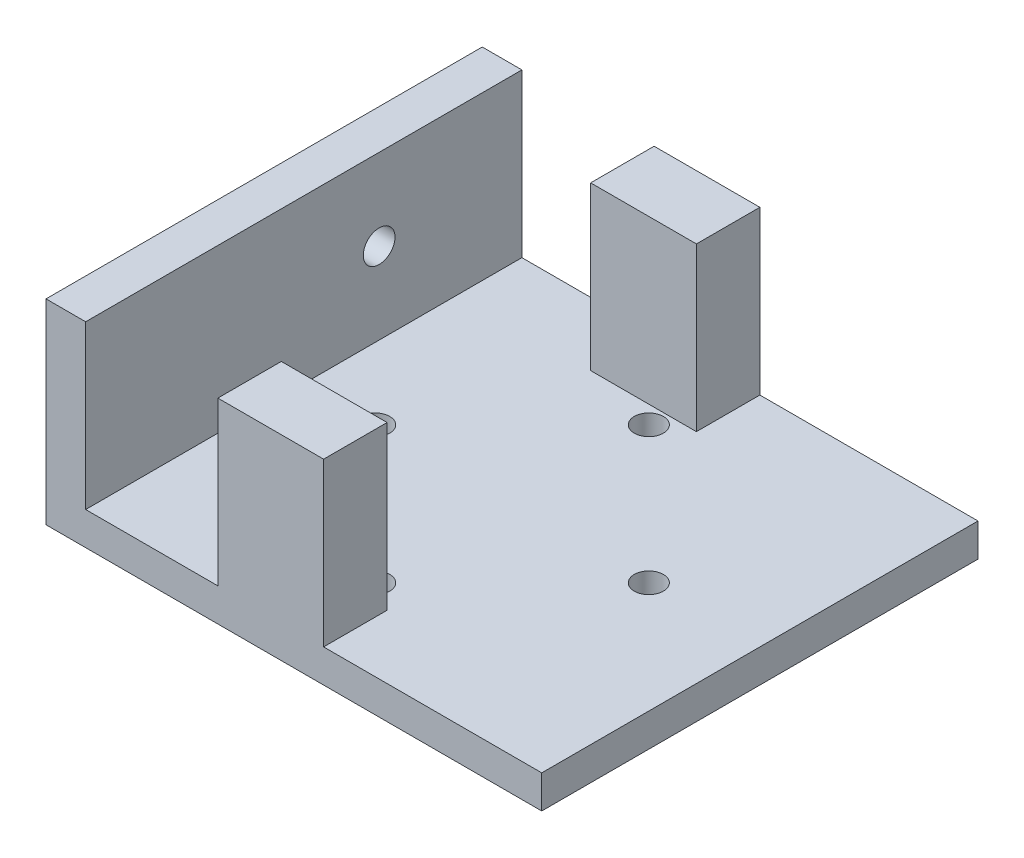
ISO-10303-21;
HEADER;
FILE_DESCRIPTION(('STEP AP214'),'2;1');
FILE_NAME('part.step','',(''),(''),'','','');
FILE_SCHEMA(('AUTOMOTIVE_DESIGN { 1 0 10303 214 1 1 1 1 }'));
ENDSEC;
DATA;
#1=APPLICATION_CONTEXT('core data for automotive mechanical design processes');
#2=APPLICATION_PROTOCOL_DEFINITION('international standard','automotive_design',2000,#1);
#3=PRODUCT_CONTEXT('',#1,'mechanical');
#4=PRODUCT('Part','Part','',(#3));
#5=PRODUCT_RELATED_PRODUCT_CATEGORY('part','',(#4));
#6=PRODUCT_DEFINITION_FORMATION('','',#4);
#7=PRODUCT_DEFINITION_CONTEXT('part definition',#1,'design');
#8=PRODUCT_DEFINITION('design','',#6,#7);
#9=PRODUCT_DEFINITION_SHAPE('','',#8);
#10=(LENGTH_UNIT() NAMED_UNIT(*) SI_UNIT(.MILLI.,.METRE.));
#11=(NAMED_UNIT(*) PLANE_ANGLE_UNIT() SI_UNIT($,.RADIAN.));
#12=(NAMED_UNIT(*) SI_UNIT($,.STERADIAN.) SOLID_ANGLE_UNIT());
#13=UNCERTAINTY_MEASURE_WITH_UNIT(LENGTH_MEASURE(1.E-05),#10,'distance_accuracy_value','');
#14=(GEOMETRIC_REPRESENTATION_CONTEXT(3) GLOBAL_UNCERTAINTY_ASSIGNED_CONTEXT((#13)) GLOBAL_UNIT_ASSIGNED_CONTEXT((#10,
#11,#12)) REPRESENTATION_CONTEXT('',''));
#15=CARTESIAN_POINT('',(0.,0.,0.));
#16=DIRECTION('',(0.,0.,1.));
#17=DIRECTION('',(1.,0.,0.));
#18=AXIS2_PLACEMENT_3D('',#15,#16,#17);
#19=CARTESIAN_POINT('',(0.,2.5,0.));
#20=DIRECTION('',(0.,-1.,0.));
#21=DIRECTION('',(0.,0.,-1.));
#22=AXIS2_PLACEMENT_3D('',#19,#20,#21);
#23=PLANE('',#22);
#24=CARTESIAN_POINT('',(-10.35,2.5,0.));
#25=DIRECTION('',(0.,-1.,0.));
#26=DIRECTION('',(0.,0.,-1.));
#27=AXIS2_PLACEMENT_3D('',#24,#25,#26);
#28=CIRCLE('',#27,1.1);
#29=CARTESIAN_POINT('',(-10.35,2.5,-1.1));
#30=VERTEX_POINT('',#29);
#31=EDGE_CURVE('E170',#30,#30,#28,.T.);
#32=ORIENTED_EDGE('',*,*,#31,.T.);
#33=EDGE_LOOP('',(#32));
#34=FACE_BOUND('',#33,.T.);
#35=CARTESIAN_POINT('',(0.,2.5,10.35));
#36=DIRECTION('',(0.,-1.,0.));
#37=DIRECTION('',(0.,0.,-1.));
#38=AXIS2_PLACEMENT_3D('',#35,#36,#37);
#39=CIRCLE('',#38,1.1);
#40=CARTESIAN_POINT('',(0.,2.5,9.25));
#41=VERTEX_POINT('',#40);
#42=EDGE_CURVE('E488',#41,#41,#39,.T.);
#43=ORIENTED_EDGE('',*,*,#42,.T.);
#44=EDGE_LOOP('',(#43));
#45=FACE_BOUND('',#44,.T.);
#46=CARTESIAN_POINT('',(10.35,2.5,0.));
#47=DIRECTION('',(0.,-1.,0.));
#48=DIRECTION('',(0.,0.,-1.));
#49=AXIS2_PLACEMENT_3D('',#46,#47,#48);
#50=CIRCLE('',#49,1.1);
#51=CARTESIAN_POINT('',(10.35,2.5,-1.1));
#52=VERTEX_POINT('',#51);
#53=EDGE_CURVE('E485',#52,#52,#50,.T.);
#54=ORIENTED_EDGE('',*,*,#53,.T.);
#55=EDGE_LOOP('',(#54));
#56=FACE_BOUND('',#55,.T.);
#57=CARTESIAN_POINT('',(0.,2.5,-10.35));
#58=DIRECTION('',(0.,-1.,0.));
#59=DIRECTION('',(0.,0.,-1.));
#60=AXIS2_PLACEMENT_3D('',#57,#58,#59);
#61=CIRCLE('',#60,1.1);
#62=CARTESIAN_POINT('',(0.,2.5,-11.45));
#63=VERTEX_POINT('',#62);
#64=EDGE_CURVE('E474',#63,#63,#61,.T.);
#65=ORIENTED_EDGE('',*,*,#64,.T.);
#66=EDGE_LOOP('',(#65));
#67=FACE_BOUND('',#66,.T.);
#68=DIRECTION('',(0.,0.,-1.));
#69=VECTOR('',#68,1.);
#70=CARTESIAN_POINT('',(2.25,2.5,-16.5));
#71=LINE('',#70,#69);
#72=CARTESIAN_POINT('',(2.25,2.5,-11.7));
#73=VERTEX_POINT('',#72);
#74=CARTESIAN_POINT('',(2.25,2.5,-16.5));
#75=VERTEX_POINT('',#74);
#76=EDGE_CURVE('E60',#73,#75,#71,.T.);
#77=ORIENTED_EDGE('',*,*,#76,.F.);
#78=DIRECTION('',(1.,0.,0.));
#79=VECTOR('',#78,1.);
#80=CARTESIAN_POINT('',(2.25,2.5,-11.7));
#81=LINE('',#80,#79);
#82=CARTESIAN_POINT('',(-5.75,2.5,-11.7));
#83=VERTEX_POINT('',#82);
#84=EDGE_CURVE('E64',#83,#73,#81,.T.);
#85=ORIENTED_EDGE('',*,*,#84,.F.);
#86=DIRECTION('',(0.,0.,1.));
#87=VECTOR('',#86,1.);
#88=CARTESIAN_POINT('',(-5.75,2.5,-16.5));
#89=LINE('',#88,#87);
#90=CARTESIAN_POINT('',(-5.75,2.5,-16.5));
#91=VERTEX_POINT('',#90);
#92=EDGE_CURVE('E157',#91,#83,#89,.T.);
#93=ORIENTED_EDGE('',*,*,#92,.F.);
#94=DIRECTION('',(-1.,0.,0.));
#95=VECTOR('',#94,1.);
#96=CARTESIAN_POINT('',(-18.75,2.5,-16.5));
#97=LINE('',#96,#95);
#98=CARTESIAN_POINT('',(-15.75,2.5,-16.5));
#99=VERTEX_POINT('',#98);
#100=EDGE_CURVE('E145',#91,#99,#97,.T.);
#101=ORIENTED_EDGE('',*,*,#100,.T.);
#102=DIRECTION('',(0.,0.,-1.));
#103=VECTOR('',#102,1.);
#104=CARTESIAN_POINT('',(-15.75,2.5,-16.5));
#105=LINE('',#104,#103);
#106=CARTESIAN_POINT('',(-15.75,2.5,16.5));
#107=VERTEX_POINT('',#106);
#108=EDGE_CURVE('E209',#107,#99,#105,.T.);
#109=ORIENTED_EDGE('',*,*,#108,.F.);
#110=DIRECTION('',(1.,0.,0.));
#111=VECTOR('',#110,1.);
#112=CARTESIAN_POINT('',(-18.75,2.5,16.5));
#113=LINE('',#112,#111);
#114=CARTESIAN_POINT('',(-5.74999999999999,2.5,16.5));
#115=VERTEX_POINT('',#114);
#116=EDGE_CURVE('E237',#107,#115,#113,.T.);
#117=ORIENTED_EDGE('',*,*,#116,.T.);
#118=DIRECTION('',(0.,0.,1.));
#119=VECTOR('',#118,1.);
#120=CARTESIAN_POINT('',(-5.74999999999999,2.5,16.5));
#121=LINE('',#120,#119);
#122=CARTESIAN_POINT('',(-5.74999999999999,2.5,11.7));
#123=VERTEX_POINT('',#122);
#124=EDGE_CURVE('E199',#123,#115,#121,.T.);
#125=ORIENTED_EDGE('',*,*,#124,.F.);
#126=DIRECTION('',(-1.,0.,0.));
#127=VECTOR('',#126,1.);
#128=CARTESIAN_POINT('',(2.25000000000001,2.5,11.7));
#129=LINE('',#128,#127);
#130=CARTESIAN_POINT('',(2.25000000000001,2.5,11.7));
#131=VERTEX_POINT('',#130);
#132=EDGE_CURVE('E202',#131,#123,#129,.T.);
#133=ORIENTED_EDGE('',*,*,#132,.F.);
#134=DIRECTION('',(0.,0.,-1.));
#135=VECTOR('',#134,1.);
#136=CARTESIAN_POINT('',(2.25000000000001,2.5,16.5));
#137=LINE('',#136,#135);
#138=CARTESIAN_POINT('',(2.25000000000001,2.5,16.5));
#139=VERTEX_POINT('',#138);
#140=EDGE_CURVE('E206',#139,#131,#137,.T.);
#141=ORIENTED_EDGE('',*,*,#140,.F.);
#142=CARTESIAN_POINT('',(18.75,2.5,16.5));
#143=VERTEX_POINT('',#142);
#144=EDGE_CURVE('E236',#139,#143,#113,.T.);
#145=ORIENTED_EDGE('',*,*,#144,.T.);
#146=DIRECTION('',(0.,0.,-1.));
#147=VECTOR('',#146,1.);
#148=CARTESIAN_POINT('',(18.75,2.5,16.5));
#149=LINE('',#148,#147);
#150=CARTESIAN_POINT('',(18.75,2.5,-16.5));
#151=VERTEX_POINT('',#150);
#152=EDGE_CURVE('E155',#143,#151,#149,.T.);
#153=ORIENTED_EDGE('',*,*,#152,.T.);
#154=EDGE_CURVE('E154',#151,#75,#97,.T.);
#155=ORIENTED_EDGE('',*,*,#154,.T.);
#156=EDGE_LOOP('',(#77,#85,#93,#101,#109,#117,#125,#133,#141,#145,#153,#155));
#157=FACE_BOUND('',#156,.T.);
#158=ADVANCED_FACE('F45',(#34,#45,#56,#67,#157),#23,.F.);
#159=CARTESIAN_POINT('',(18.75,2.5,16.5));
#160=DIRECTION('',(-1.,0.,0.));
#161=DIRECTION('',(0.,0.,1.));
#162=AXIS2_PLACEMENT_3D('',#159,#160,#161);
#163=PLANE('',#162);
#164=DIRECTION('',(0.,0.,-1.));
#165=VECTOR('',#164,1.);
#166=CARTESIAN_POINT('',(18.75,0.,16.5));
#167=LINE('',#166,#165);
#168=CARTESIAN_POINT('',(18.75,0.,16.5));
#169=VERTEX_POINT('',#168);
#170=CARTESIAN_POINT('',(18.75,0.,-16.5));
#171=VERTEX_POINT('',#170);
#172=EDGE_CURVE('E232',#169,#171,#167,.T.);
#173=ORIENTED_EDGE('',*,*,#172,.T.);
#174=DIRECTION('',(0.,-1.,0.));
#175=VECTOR('',#174,1.);
#176=CARTESIAN_POINT('',(18.75,2.5,-16.5));
#177=LINE('',#176,#175);
#178=EDGE_CURVE('E11',#151,#171,#177,.T.);
#179=ORIENTED_EDGE('',*,*,#178,.F.);
#180=ORIENTED_EDGE('',*,*,#152,.F.);
#181=DIRECTION('',(0.,-1.,0.));
#182=VECTOR('',#181,1.);
#183=CARTESIAN_POINT('',(18.75,2.5,16.5));
#184=LINE('',#183,#182);
#185=EDGE_CURVE('E239',#143,#169,#184,.T.);
#186=ORIENTED_EDGE('',*,*,#185,.T.);
#187=EDGE_LOOP('',(#173,#179,#180,#186));
#188=FACE_BOUND('',#187,.T.);
#189=ADVANCED_FACE('F47',(#188),#163,.F.);
#190=CARTESIAN_POINT('',(-18.75,2.5,-16.5));
#191=DIRECTION('',(0.,0.,1.));
#192=DIRECTION('',(1.,0.,0.));
#193=AXIS2_PLACEMENT_3D('',#190,#191,#192);
#194=PLANE('',#193);
#195=DIRECTION('',(-1.,0.,0.));
#196=VECTOR('',#195,1.);
#197=CARTESIAN_POINT('',(-18.75,0.,-16.5));
#198=LINE('',#197,#196);
#199=CARTESIAN_POINT('',(-18.75,0.,-16.5));
#200=VERTEX_POINT('',#199);
#201=EDGE_CURVE('E242',#171,#200,#198,.T.);
#202=ORIENTED_EDGE('',*,*,#201,.T.);
#203=DIRECTION('',(0.,-1.,0.));
#204=VECTOR('',#203,1.);
#205=CARTESIAN_POINT('',(-18.75,2.5,-16.5));
#206=LINE('',#205,#204);
#207=CARTESIAN_POINT('',(-18.75,14.8,-16.5));
#208=VERTEX_POINT('',#207);
#209=EDGE_CURVE('E53',#208,#200,#206,.T.);
#210=ORIENTED_EDGE('',*,*,#209,.F.);
#211=DIRECTION('',(-1.,0.,0.));
#212=VECTOR('',#211,1.);
#213=CARTESIAN_POINT('',(-18.75,14.8,-16.5));
#214=LINE('',#213,#212);
#215=CARTESIAN_POINT('',(-15.75,14.8,-16.5));
#216=VERTEX_POINT('',#215);
#217=EDGE_CURVE('E224',#216,#208,#214,.T.);
#218=ORIENTED_EDGE('',*,*,#217,.F.);
#219=DIRECTION('',(0.,-1.,0.));
#220=VECTOR('',#219,1.);
#221=CARTESIAN_POINT('',(-15.75,14.8,-16.5));
#222=LINE('',#221,#220);
#223=EDGE_CURVE('E152',#216,#99,#222,.T.);
#224=ORIENTED_EDGE('',*,*,#223,.T.);
#225=ORIENTED_EDGE('',*,*,#100,.F.);
#226=DIRECTION('',(0.,-1.,0.));
#227=VECTOR('',#226,1.);
#228=CARTESIAN_POINT('',(-5.75,14.8,-16.5));
#229=LINE('',#228,#227);
#230=CARTESIAN_POINT('',(-5.75,14.8,-16.5));
#231=VERTEX_POINT('',#230);
#232=EDGE_CURVE('E148',#231,#91,#229,.T.);
#233=ORIENTED_EDGE('',*,*,#232,.F.);
#234=DIRECTION('',(-1.,0.,0.));
#235=VECTOR('',#234,1.);
#236=CARTESIAN_POINT('',(2.25,14.8,-16.5));
#237=LINE('',#236,#235);
#238=CARTESIAN_POINT('',(2.25,14.8,-16.5));
#239=VERTEX_POINT('',#238);
#240=EDGE_CURVE('E183',#239,#231,#237,.T.);
#241=ORIENTED_EDGE('',*,*,#240,.F.);
#242=DIRECTION('',(0.,-1.,0.));
#243=VECTOR('',#242,1.);
#244=CARTESIAN_POINT('',(2.25,14.8,-16.5));
#245=LINE('',#244,#243);
#246=EDGE_CURVE('E165',#239,#75,#245,.T.);
#247=ORIENTED_EDGE('',*,*,#246,.T.);
#248=ORIENTED_EDGE('',*,*,#154,.F.);
#249=ORIENTED_EDGE('',*,*,#178,.T.);
#250=EDGE_LOOP('',(#202,#210,#218,#224,#225,#233,#241,#247,#248,#249));
#251=FACE_BOUND('',#250,.T.);
#252=ADVANCED_FACE('F146',(#251),#194,.F.);
#253=CARTESIAN_POINT('',(-18.75,2.5,16.5));
#254=DIRECTION('',(1.,0.,0.));
#255=DIRECTION('',(0.,0.,-1.));
#256=AXIS2_PLACEMENT_3D('',#253,#254,#255);
#257=PLANE('',#256);
#258=CARTESIAN_POINT('',(-18.75,8.65,-5.7));
#259=DIRECTION('',(1.,0.,0.));
#260=DIRECTION('',(0.,0.,-1.));
#261=AXIS2_PLACEMENT_3D('',#258,#259,#260);
#262=CIRCLE('',#261,1.2);
#263=CARTESIAN_POINT('',(-18.75,8.65,-6.9));
#264=VERTEX_POINT('',#263);
#265=EDGE_CURVE('E463',#264,#264,#262,.T.);
#266=ORIENTED_EDGE('',*,*,#265,.T.);
#267=EDGE_LOOP('',(#266));
#268=FACE_BOUND('',#267,.T.);
#269=DIRECTION('',(0.,0.,1.));
#270=VECTOR('',#269,1.);
#271=CARTESIAN_POINT('',(-18.75,0.,16.5));
#272=LINE('',#271,#270);
#273=CARTESIAN_POINT('',(-18.75,0.,16.5));
#274=VERTEX_POINT('',#273);
#275=EDGE_CURVE('E244',#200,#274,#272,.T.);
#276=ORIENTED_EDGE('',*,*,#275,.T.);
#277=DIRECTION('',(0.,-1.,0.));
#278=VECTOR('',#277,1.);
#279=CARTESIAN_POINT('',(-18.75,2.5,16.5));
#280=LINE('',#279,#278);
#281=CARTESIAN_POINT('',(-18.75,14.8,16.5));
#282=VERTEX_POINT('',#281);
#283=EDGE_CURVE('E249',#282,#274,#280,.T.);
#284=ORIENTED_EDGE('',*,*,#283,.F.);
#285=DIRECTION('',(0.,0.,1.));
#286=VECTOR('',#285,1.);
#287=CARTESIAN_POINT('',(-18.75,14.8,-16.5));
#288=LINE('',#287,#286);
#289=EDGE_CURVE('E217',#208,#282,#288,.T.);
#290=ORIENTED_EDGE('',*,*,#289,.F.);
#291=ORIENTED_EDGE('',*,*,#209,.T.);
#292=EDGE_LOOP('',(#276,#284,#290,#291));
#293=FACE_BOUND('',#292,.T.);
#294=ADVANCED_FACE('F255',(#268,#293),#257,.F.);
#295=CARTESIAN_POINT('',(-18.75,2.5,16.5));
#296=DIRECTION('',(0.,0.,-1.));
#297=DIRECTION('',(-1.,0.,0.));
#298=AXIS2_PLACEMENT_3D('',#295,#296,#297);
#299=PLANE('',#298);
#300=DIRECTION('',(1.,0.,0.));
#301=VECTOR('',#300,1.);
#302=CARTESIAN_POINT('',(-18.75,0.,16.5));
#303=LINE('',#302,#301);
#304=EDGE_CURVE('E234',#274,#169,#303,.T.);
#305=ORIENTED_EDGE('',*,*,#304,.T.);
#306=ORIENTED_EDGE('',*,*,#185,.F.);
#307=ORIENTED_EDGE('',*,*,#144,.F.);
#308=DIRECTION('',(0.,-1.,0.));
#309=VECTOR('',#308,1.);
#310=CARTESIAN_POINT('',(2.25000000000001,14.8,16.5));
#311=LINE('',#310,#309);
#312=CARTESIAN_POINT('',(2.25000000000001,14.8,16.5));
#313=VERTEX_POINT('',#312);
#314=EDGE_CURVE('E195',#313,#139,#311,.T.);
#315=ORIENTED_EDGE('',*,*,#314,.F.);
#316=DIRECTION('',(1.,0.,0.));
#317=VECTOR('',#316,1.);
#318=CARTESIAN_POINT('',(2.25000000000001,14.8,16.5));
#319=LINE('',#318,#317);
#320=CARTESIAN_POINT('',(-5.74999999999999,14.8,16.5));
#321=VERTEX_POINT('',#320);
#322=EDGE_CURVE('E198',#321,#313,#319,.T.);
#323=ORIENTED_EDGE('',*,*,#322,.F.);
#324=DIRECTION('',(0.,-1.,0.));
#325=VECTOR('',#324,1.);
#326=CARTESIAN_POINT('',(-5.74999999999999,14.8,16.5));
#327=LINE('',#326,#325);
#328=EDGE_CURVE('E192',#321,#115,#327,.T.);
#329=ORIENTED_EDGE('',*,*,#328,.T.);
#330=ORIENTED_EDGE('',*,*,#116,.F.);
#331=DIRECTION('',(0.,-1.,0.));
#332=VECTOR('',#331,1.);
#333=CARTESIAN_POINT('',(-15.75,14.8,16.5));
#334=LINE('',#333,#332);
#335=CARTESIAN_POINT('',(-15.75,14.8,16.5));
#336=VERTEX_POINT('',#335);
#337=EDGE_CURVE('E229',#336,#107,#334,.T.);
#338=ORIENTED_EDGE('',*,*,#337,.F.);
#339=DIRECTION('',(1.,0.,0.));
#340=VECTOR('',#339,1.);
#341=CARTESIAN_POINT('',(-18.75,14.8,16.5));
#342=LINE('',#341,#340);
#343=EDGE_CURVE('E220',#282,#336,#342,.T.);
#344=ORIENTED_EDGE('',*,*,#343,.F.);
#345=ORIENTED_EDGE('',*,*,#283,.T.);
#346=EDGE_LOOP('',(#305,#306,#307,#315,#323,#329,#330,#338,#344,#345));
#347=FACE_BOUND('',#346,.T.);
#348=ADVANCED_FACE('F262',(#347),#299,.F.);
#349=CARTESIAN_POINT('',(0.,0.,0.));
#350=DIRECTION('',(0.,-1.,0.));
#351=DIRECTION('',(0.,0.,-1.));
#352=AXIS2_PLACEMENT_3D('',#349,#350,#351);
#353=PLANE('',#352);
#354=CARTESIAN_POINT('',(-10.35,0.,0.));
#355=DIRECTION('',(0.,-1.,0.));
#356=DIRECTION('',(0.,0.,-1.));
#357=AXIS2_PLACEMENT_3D('',#354,#355,#356);
#358=CIRCLE('',#357,1.1);
#359=CARTESIAN_POINT('',(-10.35,0.,-1.1));
#360=VERTEX_POINT('',#359);
#361=EDGE_CURVE('E471',#360,#360,#358,.T.);
#362=ORIENTED_EDGE('',*,*,#361,.F.);
#363=EDGE_LOOP('',(#362));
#364=FACE_BOUND('',#363,.T.);
#365=CARTESIAN_POINT('',(0.,0.,10.35));
#366=DIRECTION('',(0.,-1.,0.));
#367=DIRECTION('',(0.,0.,-1.));
#368=AXIS2_PLACEMENT_3D('',#365,#366,#367);
#369=CIRCLE('',#368,1.1);
#370=CARTESIAN_POINT('',(0.,0.,9.25));
#371=VERTEX_POINT('',#370);
#372=EDGE_CURVE('E475',#371,#371,#369,.T.);
#373=ORIENTED_EDGE('',*,*,#372,.F.);
#374=EDGE_LOOP('',(#373));
#375=FACE_BOUND('',#374,.T.);
#376=CARTESIAN_POINT('',(10.35,0.,0.));
#377=DIRECTION('',(0.,-1.,0.));
#378=DIRECTION('',(0.,0.,-1.));
#379=AXIS2_PLACEMENT_3D('',#376,#377,#378);
#380=CIRCLE('',#379,1.1);
#381=CARTESIAN_POINT('',(10.35,0.,-1.1));
#382=VERTEX_POINT('',#381);
#383=EDGE_CURVE('E478',#382,#382,#380,.T.);
#384=ORIENTED_EDGE('',*,*,#383,.F.);
#385=EDGE_LOOP('',(#384));
#386=FACE_BOUND('',#385,.T.);
#387=CARTESIAN_POINT('',(0.,0.,-10.35));
#388=DIRECTION('',(0.,-1.,0.));
#389=DIRECTION('',(0.,0.,-1.));
#390=AXIS2_PLACEMENT_3D('',#387,#388,#389);
#391=CIRCLE('',#390,1.1);
#392=CARTESIAN_POINT('',(0.,0.,-11.45));
#393=VERTEX_POINT('',#392);
#394=EDGE_CURVE('E468',#393,#393,#391,.T.);
#395=ORIENTED_EDGE('',*,*,#394,.F.);
#396=EDGE_LOOP('',(#395));
#397=FACE_BOUND('',#396,.T.);
#398=ORIENTED_EDGE('',*,*,#172,.F.);
#399=ORIENTED_EDGE('',*,*,#304,.F.);
#400=ORIENTED_EDGE('',*,*,#275,.F.);
#401=ORIENTED_EDGE('',*,*,#201,.F.);
#402=EDGE_LOOP('',(#398,#399,#400,#401));
#403=FACE_BOUND('',#402,.T.);
#404=ADVANCED_FACE('F259',(#364,#375,#386,#397,#403),#353,.T.);
#405=CARTESIAN_POINT('',(-15.75,14.8,-16.5));
#406=DIRECTION('',(-1.,0.,0.));
#407=DIRECTION('',(0.,0.,1.));
#408=AXIS2_PLACEMENT_3D('',#405,#406,#407);
#409=PLANE('',#408);
#410=CARTESIAN_POINT('',(-15.75,8.65,-5.7));
#411=DIRECTION('',(1.,0.,0.));
#412=DIRECTION('',(0.,0.,-1.));
#413=AXIS2_PLACEMENT_3D('',#410,#411,#412);
#414=CIRCLE('',#413,1.2);
#415=CARTESIAN_POINT('',(-15.75,8.65,-6.9));
#416=VERTEX_POINT('',#415);
#417=EDGE_CURVE('E466',#416,#416,#414,.T.);
#418=ORIENTED_EDGE('',*,*,#417,.F.);
#419=EDGE_LOOP('',(#418));
#420=FACE_BOUND('',#419,.T.);
#421=ORIENTED_EDGE('',*,*,#108,.T.);
#422=ORIENTED_EDGE('',*,*,#223,.F.);
#423=DIRECTION('',(0.,0.,-1.));
#424=VECTOR('',#423,1.);
#425=CARTESIAN_POINT('',(-15.75,14.8,-16.5));
#426=LINE('',#425,#424);
#427=EDGE_CURVE('E222',#336,#216,#426,.T.);
#428=ORIENTED_EDGE('',*,*,#427,.F.);
#429=ORIENTED_EDGE('',*,*,#337,.T.);
#430=EDGE_LOOP('',(#421,#422,#428,#429));
#431=FACE_BOUND('',#430,.T.);
#432=ADVANCED_FACE('F285',(#420,#431),#409,.F.);
#433=CARTESIAN_POINT('',(0.,14.8,0.));
#434=DIRECTION('',(0.,1.,0.));
#435=DIRECTION('',(0.,0.,1.));
#436=AXIS2_PLACEMENT_3D('',#433,#434,#435);
#437=PLANE('',#436);
#438=ORIENTED_EDGE('',*,*,#289,.T.);
#439=ORIENTED_EDGE('',*,*,#343,.T.);
#440=ORIENTED_EDGE('',*,*,#427,.T.);
#441=ORIENTED_EDGE('',*,*,#217,.T.);
#442=EDGE_LOOP('',(#438,#439,#440,#441));
#443=FACE_BOUND('',#442,.T.);
#444=ADVANCED_FACE('F287',(#443),#437,.T.);
#445=CARTESIAN_POINT('',(2.25000000000001,14.8,16.5));
#446=DIRECTION('',(-1.,0.,0.));
#447=DIRECTION('',(0.,0.,1.));
#448=AXIS2_PLACEMENT_3D('',#445,#446,#447);
#449=PLANE('',#448);
#450=ORIENTED_EDGE('',*,*,#140,.T.);
#451=DIRECTION('',(0.,-1.,0.));
#452=VECTOR('',#451,1.);
#453=CARTESIAN_POINT('',(2.25000000000001,14.8,11.7));
#454=LINE('',#453,#452);
#455=CARTESIAN_POINT('',(2.25000000000001,14.8,11.7));
#456=VERTEX_POINT('',#455);
#457=EDGE_CURVE('E180',#456,#131,#454,.T.);
#458=ORIENTED_EDGE('',*,*,#457,.F.);
#459=DIRECTION('',(0.,0.,-1.));
#460=VECTOR('',#459,1.);
#461=CARTESIAN_POINT('',(2.25000000000001,14.8,16.5));
#462=LINE('',#461,#460);
#463=EDGE_CURVE('E203',#313,#456,#462,.T.);
#464=ORIENTED_EDGE('',*,*,#463,.F.);
#465=ORIENTED_EDGE('',*,*,#314,.T.);
#466=EDGE_LOOP('',(#450,#458,#464,#465));
#467=FACE_BOUND('',#466,.T.);
#468=ADVANCED_FACE('F273',(#467),#449,.F.);
#469=CARTESIAN_POINT('',(2.25000000000001,14.8,11.7));
#470=DIRECTION('',(0.,0.,1.));
#471=DIRECTION('',(1.,0.,0.));
#472=AXIS2_PLACEMENT_3D('',#469,#470,#471);
#473=PLANE('',#472);
#474=ORIENTED_EDGE('',*,*,#132,.T.);
#475=DIRECTION('',(0.,-1.,0.));
#476=VECTOR('',#475,1.);
#477=CARTESIAN_POINT('',(-5.74999999999999,14.8,11.7));
#478=LINE('',#477,#476);
#479=CARTESIAN_POINT('',(-5.74999999999999,14.8,11.7));
#480=VERTEX_POINT('',#479);
#481=EDGE_CURVE('E189',#480,#123,#478,.T.);
#482=ORIENTED_EDGE('',*,*,#481,.F.);
#483=DIRECTION('',(-1.,0.,0.));
#484=VECTOR('',#483,1.);
#485=CARTESIAN_POINT('',(2.25000000000001,14.8,11.7));
#486=LINE('',#485,#484);
#487=EDGE_CURVE('E213',#456,#480,#486,.T.);
#488=ORIENTED_EDGE('',*,*,#487,.F.);
#489=ORIENTED_EDGE('',*,*,#457,.T.);
#490=EDGE_LOOP('',(#474,#482,#488,#489));
#491=FACE_BOUND('',#490,.T.);
#492=ADVANCED_FACE('F294',(#491),#473,.F.);
#493=CARTESIAN_POINT('',(-5.74999999999999,14.8,16.5));
#494=DIRECTION('',(1.,0.,0.));
#495=DIRECTION('',(0.,0.,-1.));
#496=AXIS2_PLACEMENT_3D('',#493,#494,#495);
#497=PLANE('',#496);
#498=ORIENTED_EDGE('',*,*,#124,.T.);
#499=ORIENTED_EDGE('',*,*,#328,.F.);
#500=DIRECTION('',(0.,0.,1.));
#501=VECTOR('',#500,1.);
#502=CARTESIAN_POINT('',(-5.74999999999999,14.8,16.5));
#503=LINE('',#502,#501);
#504=EDGE_CURVE('E211',#480,#321,#503,.T.);
#505=ORIENTED_EDGE('',*,*,#504,.F.);
#506=ORIENTED_EDGE('',*,*,#481,.T.);
#507=EDGE_LOOP('',(#498,#499,#505,#506));
#508=FACE_BOUND('',#507,.T.);
#509=ADVANCED_FACE('F280',(#508),#497,.F.);
#510=CARTESIAN_POINT('',(0.,14.8,0.));
#511=DIRECTION('',(0.,1.,0.));
#512=DIRECTION('',(0.,0.,1.));
#513=AXIS2_PLACEMENT_3D('',#510,#511,#512);
#514=PLANE('',#513);
#515=ORIENTED_EDGE('',*,*,#463,.T.);
#516=ORIENTED_EDGE('',*,*,#487,.T.);
#517=ORIENTED_EDGE('',*,*,#504,.T.);
#518=ORIENTED_EDGE('',*,*,#322,.T.);
#519=EDGE_LOOP('',(#515,#516,#517,#518));
#520=FACE_BOUND('',#519,.T.);
#521=ADVANCED_FACE('F275',(#520),#514,.T.);
#522=CARTESIAN_POINT('',(2.25,14.8,-16.5));
#523=DIRECTION('',(-1.,0.,0.));
#524=DIRECTION('',(0.,0.,1.));
#525=AXIS2_PLACEMENT_3D('',#522,#523,#524);
#526=PLANE('',#525);
#527=ORIENTED_EDGE('',*,*,#76,.T.);
#528=ORIENTED_EDGE('',*,*,#246,.F.);
#529=DIRECTION('',(0.,0.,-1.));
#530=VECTOR('',#529,1.);
#531=CARTESIAN_POINT('',(2.25,14.8,-16.5));
#532=LINE('',#531,#530);
#533=CARTESIAN_POINT('',(2.25,14.8,-11.7));
#534=VERTEX_POINT('',#533);
#535=EDGE_CURVE('E177',#534,#239,#532,.T.);
#536=ORIENTED_EDGE('',*,*,#535,.F.);
#537=DIRECTION('',(0.,-1.,0.));
#538=VECTOR('',#537,1.);
#539=CARTESIAN_POINT('',(2.25,14.8,-11.7));
#540=LINE('',#539,#538);
#541=EDGE_CURVE('E167',#534,#73,#540,.T.);
#542=ORIENTED_EDGE('',*,*,#541,.T.);
#543=EDGE_LOOP('',(#527,#528,#536,#542));
#544=FACE_BOUND('',#543,.T.);
#545=ADVANCED_FACE('F373',(#544),#526,.F.);
#546=CARTESIAN_POINT('',(-5.75,14.8,-16.5));
#547=DIRECTION('',(1.,0.,0.));
#548=DIRECTION('',(0.,0.,-1.));
#549=AXIS2_PLACEMENT_3D('',#546,#547,#548);
#550=PLANE('',#549);
#551=ORIENTED_EDGE('',*,*,#92,.T.);
#552=DIRECTION('',(0.,-1.,0.));
#553=VECTOR('',#552,1.);
#554=CARTESIAN_POINT('',(-5.75,14.8,-11.7));
#555=LINE('',#554,#553);
#556=CARTESIAN_POINT('',(-5.75,14.8,-11.7));
#557=VERTEX_POINT('',#556);
#558=EDGE_CURVE('E164',#557,#83,#555,.T.);
#559=ORIENTED_EDGE('',*,*,#558,.F.);
#560=DIRECTION('',(0.,0.,1.));
#561=VECTOR('',#560,1.);
#562=CARTESIAN_POINT('',(-5.75,14.8,-16.5));
#563=LINE('',#562,#561);
#564=EDGE_CURVE('E163',#231,#557,#563,.T.);
#565=ORIENTED_EDGE('',*,*,#564,.F.);
#566=ORIENTED_EDGE('',*,*,#232,.T.);
#567=EDGE_LOOP('',(#551,#559,#565,#566));
#568=FACE_BOUND('',#567,.T.);
#569=ADVANCED_FACE('F162',(#568),#550,.F.);
#570=CARTESIAN_POINT('',(2.25,14.8,-11.7));
#571=DIRECTION('',(0.,0.,-1.));
#572=DIRECTION('',(-1.,0.,0.));
#573=AXIS2_PLACEMENT_3D('',#570,#571,#572);
#574=PLANE('',#573);
#575=ORIENTED_EDGE('',*,*,#84,.T.);
#576=ORIENTED_EDGE('',*,*,#541,.F.);
#577=DIRECTION('',(1.,0.,0.));
#578=VECTOR('',#577,1.);
#579=CARTESIAN_POINT('',(2.25,14.8,-11.7));
#580=LINE('',#579,#578);
#581=EDGE_CURVE('E176',#557,#534,#580,.T.);
#582=ORIENTED_EDGE('',*,*,#581,.F.);
#583=ORIENTED_EDGE('',*,*,#558,.T.);
#584=EDGE_LOOP('',(#575,#576,#582,#583));
#585=FACE_BOUND('',#584,.T.);
#586=ADVANCED_FACE('F390',(#585),#574,.F.);
#587=CARTESIAN_POINT('',(0.,14.8,0.));
#588=DIRECTION('',(0.,-1.,0.));
#589=DIRECTION('',(0.,0.,-1.));
#590=AXIS2_PLACEMENT_3D('',#587,#588,#589);
#591=PLANE('',#590);
#592=ORIENTED_EDGE('',*,*,#535,.T.);
#593=ORIENTED_EDGE('',*,*,#240,.T.);
#594=ORIENTED_EDGE('',*,*,#564,.T.);
#595=ORIENTED_EDGE('',*,*,#581,.T.);
#596=EDGE_LOOP('',(#592,#593,#594,#595));
#597=FACE_BOUND('',#596,.T.);
#598=ADVANCED_FACE('F399',(#597),#591,.F.);
#599=CARTESIAN_POINT('',(0.,14.8,-10.35));
#600=DIRECTION('',(0.,-1.,0.));
#601=DIRECTION('',(0.,0.,-1.));
#602=AXIS2_PLACEMENT_3D('',#599,#600,#601);
#603=CYLINDRICAL_SURFACE('',#602,1.1);
#604=ORIENTED_EDGE('',*,*,#394,.T.);
#605=EDGE_LOOP('',(#604));
#606=FACE_BOUND('',#605,.T.);
#607=ORIENTED_EDGE('',*,*,#64,.F.);
#608=EDGE_LOOP('',(#607));
#609=FACE_BOUND('',#608,.T.);
#610=ADVANCED_FACE('F408',(#606,#609),#603,.F.);
#611=CARTESIAN_POINT('',(10.35,14.8,0.));
#612=DIRECTION('',(0.,-1.,0.));
#613=DIRECTION('',(0.,0.,-1.));
#614=AXIS2_PLACEMENT_3D('',#611,#612,#613);
#615=CYLINDRICAL_SURFACE('',#614,1.1);
#616=ORIENTED_EDGE('',*,*,#383,.T.);
#617=EDGE_LOOP('',(#616));
#618=FACE_BOUND('',#617,.T.);
#619=ORIENTED_EDGE('',*,*,#53,.F.);
#620=EDGE_LOOP('',(#619));
#621=FACE_BOUND('',#620,.T.);
#622=ADVANCED_FACE('F418',(#618,#621),#615,.F.);
#623=CARTESIAN_POINT('',(0.,14.8,10.35));
#624=DIRECTION('',(0.,-1.,0.));
#625=DIRECTION('',(0.,0.,-1.));
#626=AXIS2_PLACEMENT_3D('',#623,#624,#625);
#627=CYLINDRICAL_SURFACE('',#626,1.1);
#628=ORIENTED_EDGE('',*,*,#372,.T.);
#629=EDGE_LOOP('',(#628));
#630=FACE_BOUND('',#629,.T.);
#631=ORIENTED_EDGE('',*,*,#42,.F.);
#632=EDGE_LOOP('',(#631));
#633=FACE_BOUND('',#632,.T.);
#634=ADVANCED_FACE('F428',(#630,#633),#627,.F.);
#635=CARTESIAN_POINT('',(-10.35,14.8,0.));
#636=DIRECTION('',(0.,-1.,0.));
#637=DIRECTION('',(0.,0.,-1.));
#638=AXIS2_PLACEMENT_3D('',#635,#636,#637);
#639=CYLINDRICAL_SURFACE('',#638,1.1);
#640=ORIENTED_EDGE('',*,*,#361,.T.);
#641=EDGE_LOOP('',(#640));
#642=FACE_BOUND('',#641,.T.);
#643=ORIENTED_EDGE('',*,*,#31,.F.);
#644=EDGE_LOOP('',(#643));
#645=FACE_BOUND('',#644,.T.);
#646=ADVANCED_FACE('F438',(#642,#645),#639,.F.);
#647=CARTESIAN_POINT('',(-18.75,8.65,-5.7));
#648=DIRECTION('',(1.,0.,0.));
#649=DIRECTION('',(0.,0.,-1.));
#650=AXIS2_PLACEMENT_3D('',#647,#648,#649);
#651=CYLINDRICAL_SURFACE('',#650,1.2);
#652=ORIENTED_EDGE('',*,*,#265,.F.);
#653=EDGE_LOOP('',(#652));
#654=FACE_BOUND('',#653,.T.);
#655=ORIENTED_EDGE('',*,*,#417,.T.);
#656=EDGE_LOOP('',(#655));
#657=FACE_BOUND('',#656,.T.);
#658=ADVANCED_FACE('F448',(#654,#657),#651,.F.);
#659=CLOSED_SHELL('',(#158,#189,#252,#294,#348,#404,#432,#444,#468,#492,#509,#521,#545,#569,
#586,#598,#610,#622,#634,#646,#658));
#660=MANIFOLD_SOLID_BREP('B2',#659);
#661=ADVANCED_BREP_SHAPE_REPRESENTATION('',(#18,#660),#14);
#662=SHAPE_DEFINITION_REPRESENTATION(#9,#661);
ENDSEC;
END-ISO-10303-21;
